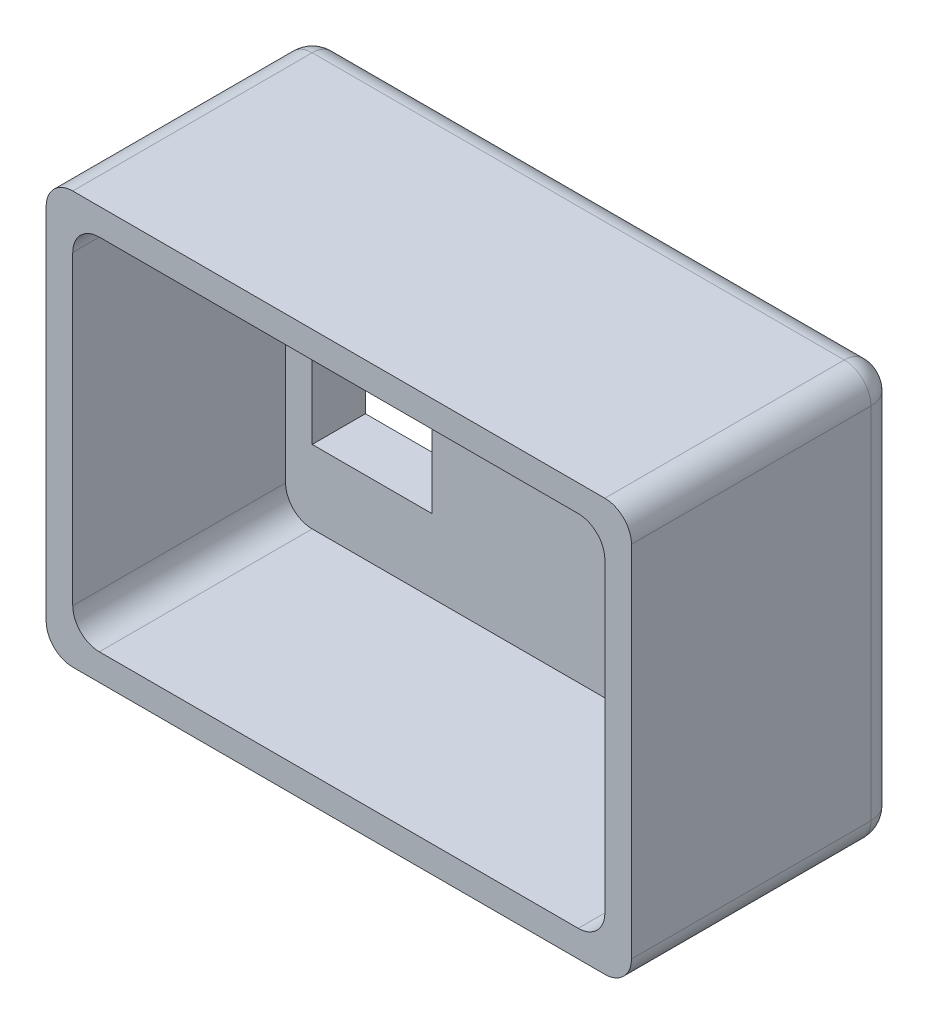
ISO-10303-21;
HEADER;
FILE_DESCRIPTION(('STEP AP214'),'2;1');
FILE_NAME('part.step','',(''),(''),'','','');
FILE_SCHEMA(('AUTOMOTIVE_DESIGN { 1 0 10303 214 1 1 1 1 }'));
ENDSEC;
DATA;
#1=APPLICATION_CONTEXT('core data for automotive mechanical design processes');
#2=APPLICATION_PROTOCOL_DEFINITION('international standard','automotive_design',2000,#1);
#3=PRODUCT_CONTEXT('',#1,'mechanical');
#4=PRODUCT('Part','Part','',(#3));
#5=PRODUCT_RELATED_PRODUCT_CATEGORY('part','',(#4));
#6=PRODUCT_DEFINITION_FORMATION('','',#4);
#7=PRODUCT_DEFINITION_CONTEXT('part definition',#1,'design');
#8=PRODUCT_DEFINITION('design','',#6,#7);
#9=PRODUCT_DEFINITION_SHAPE('','',#8);
#10=(LENGTH_UNIT() NAMED_UNIT(*) SI_UNIT(.MILLI.,.METRE.));
#11=(NAMED_UNIT(*) PLANE_ANGLE_UNIT() SI_UNIT($,.RADIAN.));
#12=(NAMED_UNIT(*) SI_UNIT($,.STERADIAN.) SOLID_ANGLE_UNIT());
#13=UNCERTAINTY_MEASURE_WITH_UNIT(LENGTH_MEASURE(1.E-05),#10,'distance_accuracy_value','');
#14=(GEOMETRIC_REPRESENTATION_CONTEXT(3) GLOBAL_UNCERTAINTY_ASSIGNED_CONTEXT((#13)) GLOBAL_UNIT_ASSIGNED_CONTEXT((#10,
#11,#12)) REPRESENTATION_CONTEXT('',''));
#15=CARTESIAN_POINT('',(0.,0.,0.));
#16=DIRECTION('',(0.,0.,1.));
#17=DIRECTION('',(1.,0.,0.));
#18=AXIS2_PLACEMENT_3D('',#15,#16,#17);
#19=CARTESIAN_POINT('',(0.,0.,2.));
#20=DIRECTION('',(0.,0.,-1.));
#21=DIRECTION('',(-1.,0.,0.));
#22=AXIS2_PLACEMENT_3D('',#19,#20,#21);
#23=PLANE('',#22);
#24=DIRECTION('',(1.,0.,0.));
#25=VECTOR('',#24,1.);
#26=CARTESIAN_POINT('',(1.,2.75,2.));
#27=LINE('',#26,#25);
#28=CARTESIAN_POINT('',(1.,2.75,2.));
#29=VERTEX_POINT('',#28);
#30=CARTESIAN_POINT('',(5.5,2.75,2.));
#31=VERTEX_POINT('',#30);
#32=EDGE_CURVE('E225',#29,#31,#27,.T.);
#33=ORIENTED_EDGE('',*,*,#32,.F.);
#34=DIRECTION('',(0.,-1.,0.));
#35=VECTOR('',#34,1.);
#36=CARTESIAN_POINT('',(1.,11.75,2.));
#37=LINE('',#36,#35);
#38=CARTESIAN_POINT('',(1.,11.75,2.));
#39=VERTEX_POINT('',#38);
#40=EDGE_CURVE('E230',#39,#29,#37,.T.);
#41=ORIENTED_EDGE('',*,*,#40,.F.);
#42=DIRECTION('',(-1.,0.,0.));
#43=VECTOR('',#42,1.);
#44=CARTESIAN_POINT('',(1.,11.75,2.));
#45=LINE('',#44,#43);
#46=CARTESIAN_POINT('',(5.5,11.75,2.));
#47=VERTEX_POINT('',#46);
#48=EDGE_CURVE('E234',#47,#39,#45,.T.);
#49=ORIENTED_EDGE('',*,*,#48,.F.);
#50=DIRECTION('',(0.,1.,0.));
#51=VECTOR('',#50,1.);
#52=CARTESIAN_POINT('',(5.5,11.75,2.));
#53=LINE('',#52,#51);
#54=EDGE_CURVE('E214',#31,#47,#53,.T.);
#55=ORIENTED_EDGE('',*,*,#54,.F.);
#56=EDGE_LOOP('',(#33,#41,#49,#55));
#57=FACE_BOUND('',#56,.T.);
#58=DIRECTION('',(0.,-1.,0.));
#59=VECTOR('',#58,1.);
#60=CARTESIAN_POINT('',(0.,0.,2.));
#61=LINE('',#60,#59);
#62=CARTESIAN_POINT('',(0.,12.5,2.));
#63=VERTEX_POINT('',#62);
#64=CARTESIAN_POINT('',(0.,1.,2.));
#65=VERTEX_POINT('',#64);
#66=EDGE_CURVE('E267',#63,#65,#61,.T.);
#67=ORIENTED_EDGE('',*,*,#66,.T.);
#68=CARTESIAN_POINT('',(1.,1.,2.));
#69=DIRECTION('',(0.,0.,-1.));
#70=DIRECTION('',(-1.,0.,0.));
#71=AXIS2_PLACEMENT_3D('',#68,#69,#70);
#72=CIRCLE('',#71,1.);
#73=CARTESIAN_POINT('',(1.,0.,2.));
#74=VERTEX_POINT('',#73);
#75=EDGE_CURVE('E297',#65,#74,#72,.F.);
#76=ORIENTED_EDGE('',*,*,#75,.T.);
#77=DIRECTION('',(1.,0.,0.));
#78=VECTOR('',#77,1.);
#79=CARTESIAN_POINT('',(0.,0.,2.));
#80=LINE('',#79,#78);
#81=CARTESIAN_POINT('',(19.,0.,2.));
#82=VERTEX_POINT('',#81);
#83=EDGE_CURVE('E270',#74,#82,#80,.T.);
#84=ORIENTED_EDGE('',*,*,#83,.T.);
#85=CARTESIAN_POINT('',(19.,1.,2.));
#86=DIRECTION('',(0.,0.,-1.));
#87=DIRECTION('',(-1.,0.,0.));
#88=AXIS2_PLACEMENT_3D('',#85,#86,#87);
#89=CIRCLE('',#88,1.);
#90=CARTESIAN_POINT('',(20.,1.,2.));
#91=VERTEX_POINT('',#90);
#92=EDGE_CURVE('E291',#82,#91,#89,.F.);
#93=ORIENTED_EDGE('',*,*,#92,.T.);
#94=DIRECTION('',(0.,1.,0.));
#95=VECTOR('',#94,1.);
#96=CARTESIAN_POINT('',(20.,0.,2.));
#97=LINE('',#96,#95);
#98=CARTESIAN_POINT('',(20.,12.5,2.));
#99=VERTEX_POINT('',#98);
#100=EDGE_CURVE('E273',#91,#99,#97,.T.);
#101=ORIENTED_EDGE('',*,*,#100,.T.);
#102=CARTESIAN_POINT('',(19.,12.5,2.));
#103=DIRECTION('',(0.,0.,-1.));
#104=DIRECTION('',(-1.,0.,0.));
#105=AXIS2_PLACEMENT_3D('',#102,#103,#104);
#106=CIRCLE('',#105,1.);
#107=CARTESIAN_POINT('',(19.,13.5,2.));
#108=VERTEX_POINT('',#107);
#109=EDGE_CURVE('E293',#99,#108,#106,.F.);
#110=ORIENTED_EDGE('',*,*,#109,.T.);
#111=DIRECTION('',(-1.,0.,0.));
#112=VECTOR('',#111,1.);
#113=CARTESIAN_POINT('',(0.,13.5,2.));
#114=LINE('',#113,#112);
#115=CARTESIAN_POINT('',(1.,13.5,2.));
#116=VERTEX_POINT('',#115);
#117=EDGE_CURVE('E276',#108,#116,#114,.T.);
#118=ORIENTED_EDGE('',*,*,#117,.T.);
#119=CARTESIAN_POINT('',(1.,12.5,2.));
#120=DIRECTION('',(0.,0.,-1.));
#121=DIRECTION('',(-1.,0.,0.));
#122=AXIS2_PLACEMENT_3D('',#119,#120,#121);
#123=CIRCLE('',#122,1.);
#124=EDGE_CURVE('E295',#116,#63,#123,.F.);
#125=ORIENTED_EDGE('',*,*,#124,.T.);
#126=EDGE_LOOP('',(#67,#76,#84,#93,#101,#110,#118,#125));
#127=FACE_BOUND('',#126,.T.);
#128=ADVANCED_FACE('F59',(#57,#127),#23,.F.);
#129=CARTESIAN_POINT('',(0.,0.,10.));
#130=DIRECTION('',(1.,0.,0.));
#131=DIRECTION('',(0.,0.,-1.));
#132=AXIS2_PLACEMENT_3D('',#129,#130,#131);
#133=PLANE('',#132);
#134=DIRECTION('',(0.,-1.,0.));
#135=VECTOR('',#134,1.);
#136=CARTESIAN_POINT('',(0.,0.,10.));
#137=LINE('',#136,#135);
#138=CARTESIAN_POINT('',(0.,12.5,10.));
#139=VERTEX_POINT('',#138);
#140=CARTESIAN_POINT('',(0.,1.,10.));
#141=VERTEX_POINT('',#140);
#142=EDGE_CURVE('E241',#139,#141,#137,.T.);
#143=ORIENTED_EDGE('',*,*,#142,.T.);
#144=DIRECTION('',(0.,0.,-1.));
#145=VECTOR('',#144,1.);
#146=CARTESIAN_POINT('',(0.,1.,2.));
#147=LINE('',#146,#145);
#148=EDGE_CURVE('E288',#141,#65,#147,.T.);
#149=ORIENTED_EDGE('',*,*,#148,.T.);
#150=ORIENTED_EDGE('',*,*,#66,.F.);
#151=DIRECTION('',(0.,0.,-1.));
#152=VECTOR('',#151,1.);
#153=CARTESIAN_POINT('',(0.,12.5,10.));
#154=LINE('',#153,#152);
#155=EDGE_CURVE('E286',#63,#139,#154,.F.);
#156=ORIENTED_EDGE('',*,*,#155,.T.);
#157=EDGE_LOOP('',(#143,#149,#150,#156));
#158=FACE_BOUND('',#157,.T.);
#159=ADVANCED_FACE('F421',(#158),#133,.T.);
#160=CARTESIAN_POINT('',(0.,0.,10.));
#161=DIRECTION('',(0.,1.,0.));
#162=DIRECTION('',(0.,0.,1.));
#163=AXIS2_PLACEMENT_3D('',#160,#161,#162);
#164=PLANE('',#163);
#165=ORIENTED_EDGE('',*,*,#83,.F.);
#166=DIRECTION('',(0.,0.,-1.));
#167=VECTOR('',#166,1.);
#168=CARTESIAN_POINT('',(1.,0.,10.));
#169=LINE('',#168,#167);
#170=CARTESIAN_POINT('',(1.,0.,10.));
#171=VERTEX_POINT('',#170);
#172=EDGE_CURVE('E302',#74,#171,#169,.F.);
#173=ORIENTED_EDGE('',*,*,#172,.T.);
#174=DIRECTION('',(1.,0.,0.));
#175=VECTOR('',#174,1.);
#176=CARTESIAN_POINT('',(0.,0.,10.));
#177=LINE('',#176,#175);
#178=CARTESIAN_POINT('',(19.,0.,10.));
#179=VERTEX_POINT('',#178);
#180=EDGE_CURVE('E246',#171,#179,#177,.T.);
#181=ORIENTED_EDGE('',*,*,#180,.T.);
#182=DIRECTION('',(0.,0.,-1.));
#183=VECTOR('',#182,1.);
#184=CARTESIAN_POINT('',(19.,0.,2.));
#185=LINE('',#184,#183);
#186=EDGE_CURVE('E299',#179,#82,#185,.T.);
#187=ORIENTED_EDGE('',*,*,#186,.T.);
#188=EDGE_LOOP('',(#165,#173,#181,#187));
#189=FACE_BOUND('',#188,.T.);
#190=ADVANCED_FACE('F425',(#189),#164,.T.);
#191=CARTESIAN_POINT('',(20.,0.,10.));
#192=DIRECTION('',(-1.,0.,0.));
#193=DIRECTION('',(0.,0.,1.));
#194=AXIS2_PLACEMENT_3D('',#191,#192,#193);
#195=PLANE('',#194);
#196=DIRECTION('',(0.,1.,0.));
#197=VECTOR('',#196,1.);
#198=CARTESIAN_POINT('',(20.,0.,10.));
#199=LINE('',#198,#197);
#200=CARTESIAN_POINT('',(20.,1.,10.));
#201=VERTEX_POINT('',#200);
#202=CARTESIAN_POINT('',(20.,12.5,10.));
#203=VERTEX_POINT('',#202);
#204=EDGE_CURVE('E249',#201,#203,#199,.T.);
#205=ORIENTED_EDGE('',*,*,#204,.T.);
#206=DIRECTION('',(0.,0.,-1.));
#207=VECTOR('',#206,1.);
#208=CARTESIAN_POINT('',(20.,12.5,2.));
#209=LINE('',#208,#207);
#210=EDGE_CURVE('E311',#203,#99,#209,.T.);
#211=ORIENTED_EDGE('',*,*,#210,.T.);
#212=ORIENTED_EDGE('',*,*,#100,.F.);
#213=DIRECTION('',(0.,0.,-1.));
#214=VECTOR('',#213,1.);
#215=CARTESIAN_POINT('',(20.,1.,10.));
#216=LINE('',#215,#214);
#217=EDGE_CURVE('E309',#91,#201,#216,.F.);
#218=ORIENTED_EDGE('',*,*,#217,.T.);
#219=EDGE_LOOP('',(#205,#211,#212,#218));
#220=FACE_BOUND('',#219,.T.);
#221=ADVANCED_FACE('F446',(#220),#195,.T.);
#222=CARTESIAN_POINT('',(0.,13.5,10.));
#223=DIRECTION('',(0.,-1.,0.));
#224=DIRECTION('',(0.,0.,-1.));
#225=AXIS2_PLACEMENT_3D('',#222,#223,#224);
#226=PLANE('',#225);
#227=DIRECTION('',(-1.,0.,0.));
#228=VECTOR('',#227,1.);
#229=CARTESIAN_POINT('',(0.,13.5,10.));
#230=LINE('',#229,#228);
#231=CARTESIAN_POINT('',(19.,13.5,10.));
#232=VERTEX_POINT('',#231);
#233=CARTESIAN_POINT('',(1.,13.5,10.));
#234=VERTEX_POINT('',#233);
#235=EDGE_CURVE('E252',#232,#234,#230,.T.);
#236=ORIENTED_EDGE('',*,*,#235,.T.);
#237=DIRECTION('',(0.,0.,-1.));
#238=VECTOR('',#237,1.);
#239=CARTESIAN_POINT('',(1.,13.5,2.));
#240=LINE('',#239,#238);
#241=EDGE_CURVE('E306',#234,#116,#240,.T.);
#242=ORIENTED_EDGE('',*,*,#241,.T.);
#243=ORIENTED_EDGE('',*,*,#117,.F.);
#244=DIRECTION('',(0.,0.,-1.));
#245=VECTOR('',#244,1.);
#246=CARTESIAN_POINT('',(19.,13.5,10.));
#247=LINE('',#246,#245);
#248=EDGE_CURVE('E304',#108,#232,#247,.F.);
#249=ORIENTED_EDGE('',*,*,#248,.T.);
#250=EDGE_LOOP('',(#236,#242,#243,#249));
#251=FACE_BOUND('',#250,.T.);
#252=ADVANCED_FACE('F441',(#251),#226,.T.);
#253=CARTESIAN_POINT('',(0.,0.,10.));
#254=DIRECTION('',(0.,0.,1.));
#255=DIRECTION('',(1.,0.,0.));
#256=AXIS2_PLACEMENT_3D('',#253,#254,#255);
#257=PLANE('',#256);
#258=DIRECTION('',(0.,-1.,0.));
#259=VECTOR('',#258,1.);
#260=CARTESIAN_POINT('',(-1.,0.,10.));
#261=LINE('',#260,#259);
#262=CARTESIAN_POINT('',(-1.,13.5,10.));
#263=VERTEX_POINT('',#262);
#264=CARTESIAN_POINT('',(-1.,0.,10.));
#265=VERTEX_POINT('',#264);
#266=EDGE_CURVE('E255',#263,#265,#261,.T.);
#267=ORIENTED_EDGE('',*,*,#266,.T.);
#268=CARTESIAN_POINT('',(0.,0.,10.));
#269=DIRECTION('',(0.,0.,1.));
#270=DIRECTION('',(1.,0.,0.));
#271=AXIS2_PLACEMENT_3D('',#268,#269,#270);
#272=CIRCLE('',#271,1.);
#273=CARTESIAN_POINT('',(0.,-1.,10.));
#274=VERTEX_POINT('',#273);
#275=EDGE_CURVE('E329',#265,#274,#272,.T.);
#276=ORIENTED_EDGE('',*,*,#275,.T.);
#277=DIRECTION('',(1.,0.,0.));
#278=VECTOR('',#277,1.);
#279=CARTESIAN_POINT('',(0.,-1.,10.));
#280=LINE('',#279,#278);
#281=CARTESIAN_POINT('',(20.,-1.,10.));
#282=VERTEX_POINT('',#281);
#283=EDGE_CURVE('E258',#274,#282,#280,.T.);
#284=ORIENTED_EDGE('',*,*,#283,.T.);
#285=CARTESIAN_POINT('',(20.,0.,10.));
#286=DIRECTION('',(0.,0.,1.));
#287=DIRECTION('',(1.,0.,0.));
#288=AXIS2_PLACEMENT_3D('',#285,#286,#287);
#289=CIRCLE('',#288,1.);
#290=CARTESIAN_POINT('',(21.,0.,10.));
#291=VERTEX_POINT('',#290);
#292=EDGE_CURVE('E325',#282,#291,#289,.T.);
#293=ORIENTED_EDGE('',*,*,#292,.T.);
#294=DIRECTION('',(0.,1.,0.));
#295=VECTOR('',#294,1.);
#296=CARTESIAN_POINT('',(21.,0.,10.));
#297=LINE('',#296,#295);
#298=CARTESIAN_POINT('',(21.,13.5,10.));
#299=VERTEX_POINT('',#298);
#300=EDGE_CURVE('E261',#291,#299,#297,.T.);
#301=ORIENTED_EDGE('',*,*,#300,.T.);
#302=CARTESIAN_POINT('',(20.,13.5,10.));
#303=DIRECTION('',(0.,0.,1.));
#304=DIRECTION('',(1.,0.,0.));
#305=AXIS2_PLACEMENT_3D('',#302,#303,#304);
#306=CIRCLE('',#305,1.);
#307=CARTESIAN_POINT('',(20.,14.5,10.));
#308=VERTEX_POINT('',#307);
#309=EDGE_CURVE('E323',#299,#308,#306,.T.);
#310=ORIENTED_EDGE('',*,*,#309,.T.);
#311=DIRECTION('',(-1.,0.,0.));
#312=VECTOR('',#311,1.);
#313=CARTESIAN_POINT('',(0.,14.5,10.));
#314=LINE('',#313,#312);
#315=CARTESIAN_POINT('',(0.,14.5,10.));
#316=VERTEX_POINT('',#315);
#317=EDGE_CURVE('E264',#308,#316,#314,.T.);
#318=ORIENTED_EDGE('',*,*,#317,.T.);
#319=CARTESIAN_POINT('',(0.,13.5,10.));
#320=DIRECTION('',(0.,0.,1.));
#321=DIRECTION('',(1.,0.,0.));
#322=AXIS2_PLACEMENT_3D('',#319,#320,#321);
#323=CIRCLE('',#322,1.);
#324=EDGE_CURVE('E327',#316,#263,#323,.T.);
#325=ORIENTED_EDGE('',*,*,#324,.T.);
#326=EDGE_LOOP('',(#267,#276,#284,#293,#301,#310,#318,#325));
#327=FACE_BOUND('',#326,.T.);
#328=ORIENTED_EDGE('',*,*,#180,.F.);
#329=CARTESIAN_POINT('',(1.,1.,10.));
#330=DIRECTION('',(0.,0.,1.));
#331=DIRECTION('',(1.,0.,0.));
#332=AXIS2_PLACEMENT_3D('',#329,#330,#331);
#333=CIRCLE('',#332,1.);
#334=EDGE_CURVE('E340',#171,#141,#333,.F.);
#335=ORIENTED_EDGE('',*,*,#334,.T.);
#336=ORIENTED_EDGE('',*,*,#142,.F.);
#337=CARTESIAN_POINT('',(1.,12.5,10.));
#338=DIRECTION('',(0.,0.,1.));
#339=DIRECTION('',(1.,0.,0.));
#340=AXIS2_PLACEMENT_3D('',#337,#338,#339);
#341=CIRCLE('',#340,1.);
#342=EDGE_CURVE('E342',#139,#234,#341,.F.);
#343=ORIENTED_EDGE('',*,*,#342,.T.);
#344=ORIENTED_EDGE('',*,*,#235,.F.);
#345=CARTESIAN_POINT('',(19.,12.5,10.));
#346=DIRECTION('',(0.,0.,1.));
#347=DIRECTION('',(1.,0.,0.));
#348=AXIS2_PLACEMENT_3D('',#345,#346,#347);
#349=CIRCLE('',#348,1.);
#350=EDGE_CURVE('E344',#232,#203,#349,.F.);
#351=ORIENTED_EDGE('',*,*,#350,.T.);
#352=ORIENTED_EDGE('',*,*,#204,.F.);
#353=CARTESIAN_POINT('',(19.,1.,10.));
#354=DIRECTION('',(0.,0.,1.));
#355=DIRECTION('',(1.,0.,0.));
#356=AXIS2_PLACEMENT_3D('',#353,#354,#355);
#357=CIRCLE('',#356,1.);
#358=EDGE_CURVE('E346',#201,#179,#357,.F.);
#359=ORIENTED_EDGE('',*,*,#358,.T.);
#360=EDGE_LOOP('',(#328,#335,#336,#343,#344,#351,#352,#359));
#361=FACE_BOUND('',#360,.T.);
#362=ADVANCED_FACE('F433',(#327,#361),#257,.T.);
#363=CARTESIAN_POINT('',(-1.,0.,10.));
#364=DIRECTION('',(1.,0.,0.));
#365=DIRECTION('',(0.,0.,-1.));
#366=AXIS2_PLACEMENT_3D('',#363,#364,#365);
#367=PLANE('',#366);
#368=DIRECTION('',(0.,0.,-1.));
#369=VECTOR('',#368,1.);
#370=CARTESIAN_POINT('',(-1.,13.5,10.));
#371=LINE('',#370,#369);
#372=CARTESIAN_POINT('',(-1.,13.5,0.999999999999999));
#373=VERTEX_POINT('',#372);
#374=EDGE_CURVE('E318',#263,#373,#371,.T.);
#375=ORIENTED_EDGE('',*,*,#374,.T.);
#376=DIRECTION('',(0.,-1.,0.));
#377=VECTOR('',#376,1.);
#378=CARTESIAN_POINT('',(-1.,0.,0.999999999999999));
#379=LINE('',#378,#377);
#380=CARTESIAN_POINT('',(-1.,0.,0.999999999999999));
#381=VERTEX_POINT('',#380);
#382=EDGE_CURVE('E351',#373,#381,#379,.T.);
#383=ORIENTED_EDGE('',*,*,#382,.T.);
#384=DIRECTION('',(0.,0.,-1.));
#385=VECTOR('',#384,1.);
#386=CARTESIAN_POINT('',(-1.,0.,10.));
#387=LINE('',#386,#385);
#388=EDGE_CURVE('E321',#381,#265,#387,.F.);
#389=ORIENTED_EDGE('',*,*,#388,.T.);
#390=ORIENTED_EDGE('',*,*,#266,.F.);
#391=EDGE_LOOP('',(#375,#383,#389,#390));
#392=FACE_BOUND('',#391,.T.);
#393=ADVANCED_FACE('F429',(#392),#367,.F.);
#394=CARTESIAN_POINT('',(0.,-1.,10.));
#395=DIRECTION('',(0.,1.,0.));
#396=DIRECTION('',(0.,0.,1.));
#397=AXIS2_PLACEMENT_3D('',#394,#395,#396);
#398=PLANE('',#397);
#399=DIRECTION('',(0.,0.,-1.));
#400=VECTOR('',#399,1.);
#401=CARTESIAN_POINT('',(0.,-1.,10.));
#402=LINE('',#401,#400);
#403=CARTESIAN_POINT('',(0.,-1.,0.999999999999999));
#404=VERTEX_POINT('',#403);
#405=EDGE_CURVE('E316',#274,#404,#402,.T.);
#406=ORIENTED_EDGE('',*,*,#405,.T.);
#407=DIRECTION('',(1.,0.,0.));
#408=VECTOR('',#407,1.);
#409=CARTESIAN_POINT('',(20.,-1.,0.999999999999999));
#410=LINE('',#409,#408);
#411=CARTESIAN_POINT('',(20.,-1.,0.999999999999999));
#412=VERTEX_POINT('',#411);
#413=EDGE_CURVE('E12',#404,#412,#410,.T.);
#414=ORIENTED_EDGE('',*,*,#413,.T.);
#415=DIRECTION('',(0.,0.,-1.));
#416=VECTOR('',#415,1.);
#417=CARTESIAN_POINT('',(20.,-1.,10.));
#418=LINE('',#417,#416);
#419=EDGE_CURVE('E314',#412,#282,#418,.F.);
#420=ORIENTED_EDGE('',*,*,#419,.T.);
#421=ORIENTED_EDGE('',*,*,#283,.F.);
#422=EDGE_LOOP('',(#406,#414,#420,#421));
#423=FACE_BOUND('',#422,.T.);
#424=ADVANCED_FACE('F432',(#423),#398,.F.);
#425=CARTESIAN_POINT('',(21.,0.,10.));
#426=DIRECTION('',(-1.,0.,0.));
#427=DIRECTION('',(0.,0.,1.));
#428=AXIS2_PLACEMENT_3D('',#425,#426,#427);
#429=PLANE('',#428);
#430=DIRECTION('',(0.,0.,-1.));
#431=VECTOR('',#430,1.);
#432=CARTESIAN_POINT('',(21.,0.,10.));
#433=LINE('',#432,#431);
#434=CARTESIAN_POINT('',(21.,0.,0.999999999999999));
#435=VERTEX_POINT('',#434);
#436=EDGE_CURVE('E338',#291,#435,#433,.T.);
#437=ORIENTED_EDGE('',*,*,#436,.T.);
#438=DIRECTION('',(0.,1.,0.));
#439=VECTOR('',#438,1.);
#440=CARTESIAN_POINT('',(21.,13.5,0.999999999999999));
#441=LINE('',#440,#439);
#442=CARTESIAN_POINT('',(21.,13.5,0.999999999999999));
#443=VERTEX_POINT('',#442);
#444=EDGE_CURVE('E368',#435,#443,#441,.T.);
#445=ORIENTED_EDGE('',*,*,#444,.T.);
#446=DIRECTION('',(0.,0.,-1.));
#447=VECTOR('',#446,1.);
#448=CARTESIAN_POINT('',(21.,13.5,10.));
#449=LINE('',#448,#447);
#450=EDGE_CURVE('E336',#443,#299,#449,.F.);
#451=ORIENTED_EDGE('',*,*,#450,.T.);
#452=ORIENTED_EDGE('',*,*,#300,.F.);
#453=EDGE_LOOP('',(#437,#445,#451,#452));
#454=FACE_BOUND('',#453,.T.);
#455=ADVANCED_FACE('F415',(#454),#429,.F.);
#456=CARTESIAN_POINT('',(0.,14.5,10.));
#457=DIRECTION('',(0.,-1.,0.));
#458=DIRECTION('',(0.,0.,-1.));
#459=AXIS2_PLACEMENT_3D('',#456,#457,#458);
#460=PLANE('',#459);
#461=DIRECTION('',(0.,0.,-1.));
#462=VECTOR('',#461,1.);
#463=CARTESIAN_POINT('',(20.,14.5,10.));
#464=LINE('',#463,#462);
#465=CARTESIAN_POINT('',(20.,14.5,0.999999999999999));
#466=VERTEX_POINT('',#465);
#467=EDGE_CURVE('E331',#308,#466,#464,.T.);
#468=ORIENTED_EDGE('',*,*,#467,.T.);
#469=DIRECTION('',(-1.,0.,0.));
#470=VECTOR('',#469,1.);
#471=CARTESIAN_POINT('',(0.,14.5,0.999999999999999));
#472=LINE('',#471,#470);
#473=CARTESIAN_POINT('',(0.,14.5,0.999999999999999));
#474=VERTEX_POINT('',#473);
#475=EDGE_CURVE('E364',#466,#474,#472,.T.);
#476=ORIENTED_EDGE('',*,*,#475,.T.);
#477=DIRECTION('',(0.,0.,-1.));
#478=VECTOR('',#477,1.);
#479=CARTESIAN_POINT('',(0.,14.5,10.));
#480=LINE('',#479,#478);
#481=EDGE_CURVE('E334',#474,#316,#480,.F.);
#482=ORIENTED_EDGE('',*,*,#481,.T.);
#483=ORIENTED_EDGE('',*,*,#317,.F.);
#484=EDGE_LOOP('',(#468,#476,#482,#483));
#485=FACE_BOUND('',#484,.T.);
#486=ADVANCED_FACE('F407',(#485),#460,.F.);
#487=CARTESIAN_POINT('',(0.,0.,0.));
#488=DIRECTION('',(0.,0.,-1.));
#489=DIRECTION('',(-1.,0.,0.));
#490=AXIS2_PLACEMENT_3D('',#487,#488,#489);
#491=PLANE('',#490);
#492=DIRECTION('',(1.,0.,0.));
#493=VECTOR('',#492,1.);
#494=CARTESIAN_POINT('',(0.,0.,0.));
#495=LINE('',#494,#493);
#496=CARTESIAN_POINT('',(20.,0.,0.));
#497=VERTEX_POINT('',#496);
#498=CARTESIAN_POINT('',(0.,0.,0.));
#499=VERTEX_POINT('',#498);
#500=EDGE_CURVE('E353',#497,#499,#495,.F.);
#501=ORIENTED_EDGE('',*,*,#500,.T.);
#502=DIRECTION('',(0.,-1.,0.));
#503=VECTOR('',#502,1.);
#504=CARTESIAN_POINT('',(0.,13.5,0.));
#505=LINE('',#504,#503);
#506=CARTESIAN_POINT('',(0.,13.5,0.));
#507=VERTEX_POINT('',#506);
#508=EDGE_CURVE('E359',#499,#507,#505,.F.);
#509=ORIENTED_EDGE('',*,*,#508,.T.);
#510=DIRECTION('',(-1.,0.,0.));
#511=VECTOR('',#510,1.);
#512=CARTESIAN_POINT('',(20.,13.5,0.));
#513=LINE('',#512,#511);
#514=CARTESIAN_POINT('',(20.,13.5,0.));
#515=VERTEX_POINT('',#514);
#516=EDGE_CURVE('E357',#507,#515,#513,.F.);
#517=ORIENTED_EDGE('',*,*,#516,.T.);
#518=DIRECTION('',(0.,1.,0.));
#519=VECTOR('',#518,1.);
#520=CARTESIAN_POINT('',(20.,0.,0.));
#521=LINE('',#520,#519);
#522=EDGE_CURVE('E355',#515,#497,#521,.F.);
#523=ORIENTED_EDGE('',*,*,#522,.T.);
#524=EDGE_LOOP('',(#501,#509,#517,#523));
#525=FACE_BOUND('',#524,.T.);
#526=DIRECTION('',(0.,1.,0.));
#527=VECTOR('',#526,1.);
#528=CARTESIAN_POINT('',(1.,0.,0.));
#529=LINE('',#528,#527);
#530=CARTESIAN_POINT('',(1.,2.75,0.));
#531=VERTEX_POINT('',#530);
#532=CARTESIAN_POINT('',(1.,11.75,0.));
#533=VERTEX_POINT('',#532);
#534=EDGE_CURVE('E284',#531,#533,#529,.T.);
#535=ORIENTED_EDGE('',*,*,#534,.F.);
#536=DIRECTION('',(-1.,0.,0.));
#537=VECTOR('',#536,1.);
#538=CARTESIAN_POINT('',(0.,2.75,0.));
#539=LINE('',#538,#537);
#540=CARTESIAN_POINT('',(5.5,2.75,0.));
#541=VERTEX_POINT('',#540);
#542=EDGE_CURVE('E279',#541,#531,#539,.T.);
#543=ORIENTED_EDGE('',*,*,#542,.F.);
#544=DIRECTION('',(0.,-1.,0.));
#545=VECTOR('',#544,1.);
#546=CARTESIAN_POINT('',(5.5,0.,0.));
#547=LINE('',#546,#545);
#548=CARTESIAN_POINT('',(5.5,11.75,0.));
#549=VERTEX_POINT('',#548);
#550=EDGE_CURVE('E217',#549,#541,#547,.T.);
#551=ORIENTED_EDGE('',*,*,#550,.F.);
#552=DIRECTION('',(1.,0.,0.));
#553=VECTOR('',#552,1.);
#554=CARTESIAN_POINT('',(0.,11.75,0.));
#555=LINE('',#554,#553);
#556=EDGE_CURVE('E282',#533,#549,#555,.T.);
#557=ORIENTED_EDGE('',*,*,#556,.F.);
#558=EDGE_LOOP('',(#535,#543,#551,#557));
#559=FACE_BOUND('',#558,.T.);
#560=ADVANCED_FACE('F405',(#525,#559),#491,.T.);
#561=CARTESIAN_POINT('',(1.,11.75,-8.));
#562=DIRECTION('',(-1.,0.,0.));
#563=DIRECTION('',(0.,-1.,0.));
#564=AXIS2_PLACEMENT_3D('',#561,#562,#563);
#565=PLANE('',#564);
#566=ORIENTED_EDGE('',*,*,#534,.T.);
#567=DIRECTION('',(0.,0.,1.));
#568=VECTOR('',#567,1.);
#569=CARTESIAN_POINT('',(1.,11.75,-8.));
#570=LINE('',#569,#568);
#571=EDGE_CURVE('E239',#533,#39,#570,.T.);
#572=ORIENTED_EDGE('',*,*,#571,.T.);
#573=ORIENTED_EDGE('',*,*,#40,.T.);
#574=DIRECTION('',(0.,0.,1.));
#575=VECTOR('',#574,1.);
#576=CARTESIAN_POINT('',(1.,2.75,-8.));
#577=LINE('',#576,#575);
#578=EDGE_CURVE('E221',#531,#29,#577,.T.);
#579=ORIENTED_EDGE('',*,*,#578,.F.);
#580=EDGE_LOOP('',(#566,#572,#573,#579));
#581=FACE_BOUND('',#580,.T.);
#582=ADVANCED_FACE('F398',(#581),#565,.F.);
#583=CARTESIAN_POINT('',(1.,11.75,-8.));
#584=DIRECTION('',(0.,1.,0.));
#585=DIRECTION('',(0.,0.,1.));
#586=AXIS2_PLACEMENT_3D('',#583,#584,#585);
#587=PLANE('',#586);
#588=ORIENTED_EDGE('',*,*,#556,.T.);
#589=DIRECTION('',(0.,0.,1.));
#590=VECTOR('',#589,1.);
#591=CARTESIAN_POINT('',(5.5,11.75,-8.));
#592=LINE('',#591,#590);
#593=EDGE_CURVE('E220',#549,#47,#592,.T.);
#594=ORIENTED_EDGE('',*,*,#593,.T.);
#595=ORIENTED_EDGE('',*,*,#48,.T.);
#596=ORIENTED_EDGE('',*,*,#571,.F.);
#597=EDGE_LOOP('',(#588,#594,#595,#596));
#598=FACE_BOUND('',#597,.T.);
#599=ADVANCED_FACE('F403',(#598),#587,.F.);
#600=CARTESIAN_POINT('',(5.5,11.75,-8.));
#601=DIRECTION('',(1.,0.,0.));
#602=DIRECTION('',(0.,1.,0.));
#603=AXIS2_PLACEMENT_3D('',#600,#601,#602);
#604=PLANE('',#603);
#605=ORIENTED_EDGE('',*,*,#550,.T.);
#606=DIRECTION('',(0.,0.,1.));
#607=VECTOR('',#606,1.);
#608=CARTESIAN_POINT('',(5.5,2.75,-8.));
#609=LINE('',#608,#607);
#610=EDGE_CURVE('E209',#541,#31,#609,.T.);
#611=ORIENTED_EDGE('',*,*,#610,.T.);
#612=ORIENTED_EDGE('',*,*,#54,.T.);
#613=ORIENTED_EDGE('',*,*,#593,.F.);
#614=EDGE_LOOP('',(#605,#611,#612,#613));
#615=FACE_BOUND('',#614,.T.);
#616=ADVANCED_FACE('F211',(#615),#604,.F.);
#617=CARTESIAN_POINT('',(1.,2.75,-8.));
#618=DIRECTION('',(0.,-1.,0.));
#619=DIRECTION('',(1.,0.,0.));
#620=AXIS2_PLACEMENT_3D('',#617,#618,#619);
#621=PLANE('',#620);
#622=ORIENTED_EDGE('',*,*,#542,.T.);
#623=ORIENTED_EDGE('',*,*,#578,.T.);
#624=ORIENTED_EDGE('',*,*,#32,.T.);
#625=ORIENTED_EDGE('',*,*,#610,.F.);
#626=EDGE_LOOP('',(#622,#623,#624,#625));
#627=FACE_BOUND('',#626,.T.);
#628=ADVANCED_FACE('F226',(#627),#621,.F.);
#629=CARTESIAN_POINT('',(1.,1.,10.));
#630=DIRECTION('',(0.,0.,1.));
#631=DIRECTION('',(1.,0.,0.));
#632=AXIS2_PLACEMENT_3D('',#629,#630,#631);
#633=CYLINDRICAL_SURFACE('',#632,1.);
#634=ORIENTED_EDGE('',*,*,#334,.F.);
#635=ORIENTED_EDGE('',*,*,#172,.F.);
#636=ORIENTED_EDGE('',*,*,#75,.F.);
#637=ORIENTED_EDGE('',*,*,#148,.F.);
#638=EDGE_LOOP('',(#634,#635,#636,#637));
#639=FACE_BOUND('',#638,.T.);
#640=ADVANCED_FACE('F456',(#639),#633,.F.);
#641=CARTESIAN_POINT('',(1.,12.5,10.));
#642=DIRECTION('',(0.,0.,1.));
#643=DIRECTION('',(1.,0.,0.));
#644=AXIS2_PLACEMENT_3D('',#641,#642,#643);
#645=CYLINDRICAL_SURFACE('',#644,1.);
#646=ORIENTED_EDGE('',*,*,#342,.F.);
#647=ORIENTED_EDGE('',*,*,#155,.F.);
#648=ORIENTED_EDGE('',*,*,#124,.F.);
#649=ORIENTED_EDGE('',*,*,#241,.F.);
#650=EDGE_LOOP('',(#646,#647,#648,#649));
#651=FACE_BOUND('',#650,.T.);
#652=ADVANCED_FACE('F478',(#651),#645,.F.);
#653=CARTESIAN_POINT('',(19.,12.5,10.));
#654=DIRECTION('',(0.,0.,1.));
#655=DIRECTION('',(1.,0.,0.));
#656=AXIS2_PLACEMENT_3D('',#653,#654,#655);
#657=CYLINDRICAL_SURFACE('',#656,1.);
#658=ORIENTED_EDGE('',*,*,#350,.F.);
#659=ORIENTED_EDGE('',*,*,#248,.F.);
#660=ORIENTED_EDGE('',*,*,#109,.F.);
#661=ORIENTED_EDGE('',*,*,#210,.F.);
#662=EDGE_LOOP('',(#658,#659,#660,#661));
#663=FACE_BOUND('',#662,.T.);
#664=ADVANCED_FACE('F486',(#663),#657,.F.);
#665=CARTESIAN_POINT('',(19.,1.,10.));
#666=DIRECTION('',(0.,0.,1.));
#667=DIRECTION('',(1.,0.,0.));
#668=AXIS2_PLACEMENT_3D('',#665,#666,#667);
#669=CYLINDRICAL_SURFACE('',#668,1.);
#670=ORIENTED_EDGE('',*,*,#358,.F.);
#671=ORIENTED_EDGE('',*,*,#217,.F.);
#672=ORIENTED_EDGE('',*,*,#92,.F.);
#673=ORIENTED_EDGE('',*,*,#186,.F.);
#674=EDGE_LOOP('',(#670,#671,#672,#673));
#675=FACE_BOUND('',#674,.T.);
#676=ADVANCED_FACE('F494',(#675),#669,.F.);
#677=CARTESIAN_POINT('',(0.,0.,10.));
#678=DIRECTION('',(0.,0.,-1.));
#679=DIRECTION('',(-1.,0.,0.));
#680=AXIS2_PLACEMENT_3D('',#677,#678,#679);
#681=CYLINDRICAL_SURFACE('',#680,1.);
#682=ORIENTED_EDGE('',*,*,#388,.F.);
#683=CARTESIAN_POINT('',(0.,0.,0.999999999999999));
#684=DIRECTION('',(0.,0.,-1.));
#685=DIRECTION('',(-1.,0.,0.));
#686=AXIS2_PLACEMENT_3D('',#683,#684,#685);
#687=CIRCLE('',#686,1.);
#688=EDGE_CURVE('E348',#381,#404,#687,.F.);
#689=ORIENTED_EDGE('',*,*,#688,.T.);
#690=ORIENTED_EDGE('',*,*,#405,.F.);
#691=ORIENTED_EDGE('',*,*,#275,.F.);
#692=EDGE_LOOP('',(#682,#689,#690,#691));
#693=FACE_BOUND('',#692,.T.);
#694=ADVANCED_FACE('F502',(#693),#681,.T.);
#695=CARTESIAN_POINT('',(0.,13.5,10.));
#696=DIRECTION('',(0.,0.,-1.));
#697=DIRECTION('',(-1.,0.,0.));
#698=AXIS2_PLACEMENT_3D('',#695,#696,#697);
#699=CYLINDRICAL_SURFACE('',#698,1.);
#700=ORIENTED_EDGE('',*,*,#481,.F.);
#701=CARTESIAN_POINT('',(0.,13.5,0.999999999999999));
#702=DIRECTION('',(0.,0.,-1.));
#703=DIRECTION('',(-1.,0.,0.));
#704=AXIS2_PLACEMENT_3D('',#701,#702,#703);
#705=CIRCLE('',#704,1.);
#706=EDGE_CURVE('E362',#474,#373,#705,.F.);
#707=ORIENTED_EDGE('',*,*,#706,.T.);
#708=ORIENTED_EDGE('',*,*,#374,.F.);
#709=ORIENTED_EDGE('',*,*,#324,.F.);
#710=EDGE_LOOP('',(#700,#707,#708,#709));
#711=FACE_BOUND('',#710,.T.);
#712=ADVANCED_FACE('F511',(#711),#699,.T.);
#713=CARTESIAN_POINT('',(20.,0.,10.));
#714=DIRECTION('',(0.,0.,-1.));
#715=DIRECTION('',(-1.,0.,0.));
#716=AXIS2_PLACEMENT_3D('',#713,#714,#715);
#717=CYLINDRICAL_SURFACE('',#716,1.);
#718=ORIENTED_EDGE('',*,*,#419,.F.);
#719=CARTESIAN_POINT('',(20.,0.,0.999999999999999));
#720=DIRECTION('',(0.,0.,-1.));
#721=DIRECTION('',(-1.,0.,0.));
#722=AXIS2_PLACEMENT_3D('',#719,#720,#721);
#723=CIRCLE('',#722,1.);
#724=EDGE_CURVE('E68',#412,#435,#723,.F.);
#725=ORIENTED_EDGE('',*,*,#724,.T.);
#726=ORIENTED_EDGE('',*,*,#436,.F.);
#727=ORIENTED_EDGE('',*,*,#292,.F.);
#728=EDGE_LOOP('',(#718,#725,#726,#727));
#729=FACE_BOUND('',#728,.T.);
#730=ADVANCED_FACE('F519',(#729),#717,.T.);
#731=CARTESIAN_POINT('',(20.,13.5,10.));
#732=DIRECTION('',(0.,0.,-1.));
#733=DIRECTION('',(-1.,0.,0.));
#734=AXIS2_PLACEMENT_3D('',#731,#732,#733);
#735=CYLINDRICAL_SURFACE('',#734,1.);
#736=ORIENTED_EDGE('',*,*,#450,.F.);
#737=CARTESIAN_POINT('',(20.,13.5,0.999999999999999));
#738=DIRECTION('',(0.,0.,-1.));
#739=DIRECTION('',(-1.,0.,0.));
#740=AXIS2_PLACEMENT_3D('',#737,#738,#739);
#741=CIRCLE('',#740,1.);
#742=EDGE_CURVE('E366',#443,#466,#741,.F.);
#743=ORIENTED_EDGE('',*,*,#742,.T.);
#744=ORIENTED_EDGE('',*,*,#467,.F.);
#745=ORIENTED_EDGE('',*,*,#309,.F.);
#746=EDGE_LOOP('',(#736,#743,#744,#745));
#747=FACE_BOUND('',#746,.T.);
#748=ADVANCED_FACE('F527',(#747),#735,.T.);
#749=CARTESIAN_POINT('',(20.,13.5,0.999999999999999));
#750=DIRECTION('',(0.,0.,-1.));
#751=DIRECTION('',(-1.,0.,0.));
#752=AXIS2_PLACEMENT_3D('',#749,#750,#751);
#753=SPHERICAL_SURFACE('',#752,1.);
#754=CARTESIAN_POINT('',(20.,13.5,0.999999999999999));
#755=DIRECTION('',(-1.,0.,0.));
#756=DIRECTION('',(0.,0.,1.));
#757=AXIS2_PLACEMENT_3D('',#754,#755,#756);
#758=CIRCLE('',#757,1.);
#759=EDGE_CURVE('E386',#466,#515,#758,.T.);
#760=ORIENTED_EDGE('',*,*,#759,.F.);
#761=ORIENTED_EDGE('',*,*,#742,.F.);
#762=CARTESIAN_POINT('',(20.,13.5,1.));
#763=DIRECTION('',(0.,-1.,0.));
#764=DIRECTION('',(0.,0.,-1.));
#765=AXIS2_PLACEMENT_3D('',#762,#763,#764);
#766=CIRCLE('',#765,1.);
#767=EDGE_CURVE('E63',#515,#443,#766,.T.);
#768=ORIENTED_EDGE('',*,*,#767,.F.);
#769=EDGE_LOOP('',(#760,#761,#768));
#770=FACE_BOUND('',#769,.T.);
#771=ADVANCED_FACE('F61',(#770),#753,.T.);
#772=CARTESIAN_POINT('',(20.,0.,0.999999999999999));
#773=DIRECTION('',(0.,-1.,0.));
#774=DIRECTION('',(0.,0.,-1.));
#775=AXIS2_PLACEMENT_3D('',#772,#773,#774);
#776=CYLINDRICAL_SURFACE('',#775,1.);
#777=ORIENTED_EDGE('',*,*,#767,.T.);
#778=ORIENTED_EDGE('',*,*,#444,.F.);
#779=CARTESIAN_POINT('',(20.,0.,1.));
#780=DIRECTION('',(0.,-1.,0.));
#781=DIRECTION('',(0.,0.,-1.));
#782=AXIS2_PLACEMENT_3D('',#779,#780,#781);
#783=CIRCLE('',#782,1.);
#784=EDGE_CURVE('E384',#497,#435,#783,.T.);
#785=ORIENTED_EDGE('',*,*,#784,.F.);
#786=ORIENTED_EDGE('',*,*,#522,.F.);
#787=EDGE_LOOP('',(#777,#778,#785,#786));
#788=FACE_BOUND('',#787,.T.);
#789=ADVANCED_FACE('F541',(#788),#776,.T.);
#790=CARTESIAN_POINT('',(0.,13.5,0.999999999999999));
#791=DIRECTION('',(1.,0.,0.));
#792=DIRECTION('',(0.,0.,-1.));
#793=AXIS2_PLACEMENT_3D('',#790,#791,#792);
#794=CYLINDRICAL_SURFACE('',#793,1.);
#795=ORIENTED_EDGE('',*,*,#759,.T.);
#796=ORIENTED_EDGE('',*,*,#516,.F.);
#797=CARTESIAN_POINT('',(0.,13.5,0.999999999999999));
#798=DIRECTION('',(-1.,0.,0.));
#799=DIRECTION('',(0.,0.,1.));
#800=AXIS2_PLACEMENT_3D('',#797,#798,#799);
#801=CIRCLE('',#800,1.);
#802=EDGE_CURVE('E381',#474,#507,#801,.T.);
#803=ORIENTED_EDGE('',*,*,#802,.F.);
#804=ORIENTED_EDGE('',*,*,#475,.F.);
#805=EDGE_LOOP('',(#795,#796,#803,#804));
#806=FACE_BOUND('',#805,.T.);
#807=ADVANCED_FACE('F548',(#806),#794,.T.);
#808=CARTESIAN_POINT('',(20.,0.,0.999999999999999));
#809=DIRECTION('',(0.,0.,-1.));
#810=DIRECTION('',(-1.,0.,0.));
#811=AXIS2_PLACEMENT_3D('',#808,#809,#810);
#812=SPHERICAL_SURFACE('',#811,1.);
#813=ORIENTED_EDGE('',*,*,#784,.T.);
#814=ORIENTED_EDGE('',*,*,#724,.F.);
#815=CARTESIAN_POINT('',(20.,0.,1.));
#816=DIRECTION('',(-1.,0.,0.));
#817=DIRECTION('',(0.,0.,1.));
#818=AXIS2_PLACEMENT_3D('',#815,#816,#817);
#819=CIRCLE('',#818,1.);
#820=EDGE_CURVE('E378',#497,#412,#819,.T.);
#821=ORIENTED_EDGE('',*,*,#820,.F.);
#822=EDGE_LOOP('',(#813,#814,#821));
#823=FACE_BOUND('',#822,.T.);
#824=ADVANCED_FACE('F554',(#823),#812,.T.);
#825=CARTESIAN_POINT('',(0.,13.5,0.999999999999999));
#826=DIRECTION('',(0.,0.,-1.));
#827=DIRECTION('',(-1.,0.,0.));
#828=AXIS2_PLACEMENT_3D('',#825,#826,#827);
#829=SPHERICAL_SURFACE('',#828,1.);
#830=ORIENTED_EDGE('',*,*,#706,.F.);
#831=ORIENTED_EDGE('',*,*,#802,.T.);
#832=CARTESIAN_POINT('',(0.,13.5,0.999999999999999));
#833=DIRECTION('',(0.,-1.,0.));
#834=DIRECTION('',(0.,0.,-1.));
#835=AXIS2_PLACEMENT_3D('',#832,#833,#834);
#836=CIRCLE('',#835,1.);
#837=EDGE_CURVE('E376',#373,#507,#836,.T.);
#838=ORIENTED_EDGE('',*,*,#837,.F.);
#839=EDGE_LOOP('',(#830,#831,#838));
#840=FACE_BOUND('',#839,.T.);
#841=ADVANCED_FACE('F561',(#840),#829,.T.);
#842=CARTESIAN_POINT('',(0.,0.,0.999999999999999));
#843=DIRECTION('',(-1.,0.,0.));
#844=DIRECTION('',(0.,0.,1.));
#845=AXIS2_PLACEMENT_3D('',#842,#843,#844);
#846=CYLINDRICAL_SURFACE('',#845,1.);
#847=ORIENTED_EDGE('',*,*,#820,.T.);
#848=ORIENTED_EDGE('',*,*,#413,.F.);
#849=CARTESIAN_POINT('',(0.,0.,1.));
#850=DIRECTION('',(-1.,0.,0.));
#851=DIRECTION('',(0.,0.,1.));
#852=AXIS2_PLACEMENT_3D('',#849,#850,#851);
#853=CIRCLE('',#852,1.);
#854=EDGE_CURVE('E374',#499,#404,#853,.T.);
#855=ORIENTED_EDGE('',*,*,#854,.F.);
#856=ORIENTED_EDGE('',*,*,#500,.F.);
#857=EDGE_LOOP('',(#847,#848,#855,#856));
#858=FACE_BOUND('',#857,.T.);
#859=ADVANCED_FACE('F569',(#858),#846,.T.);
#860=CARTESIAN_POINT('',(0.,0.,0.999999999999999));
#861=DIRECTION('',(0.,1.,0.));
#862=DIRECTION('',(0.,0.,1.));
#863=AXIS2_PLACEMENT_3D('',#860,#861,#862);
#864=CYLINDRICAL_SURFACE('',#863,1.);
#865=ORIENTED_EDGE('',*,*,#837,.T.);
#866=ORIENTED_EDGE('',*,*,#508,.F.);
#867=CARTESIAN_POINT('',(0.,0.,0.999999999999999));
#868=DIRECTION('',(0.,-1.,0.));
#869=DIRECTION('',(0.,0.,-1.));
#870=AXIS2_PLACEMENT_3D('',#867,#868,#869);
#871=CIRCLE('',#870,1.);
#872=EDGE_CURVE('E371',#381,#499,#871,.T.);
#873=ORIENTED_EDGE('',*,*,#872,.F.);
#874=ORIENTED_EDGE('',*,*,#382,.F.);
#875=EDGE_LOOP('',(#865,#866,#873,#874));
#876=FACE_BOUND('',#875,.T.);
#877=ADVANCED_FACE('F577',(#876),#864,.T.);
#878=CARTESIAN_POINT('',(0.,0.,0.999999999999999));
#879=DIRECTION('',(0.,0.,-1.));
#880=DIRECTION('',(-1.,0.,0.));
#881=AXIS2_PLACEMENT_3D('',#878,#879,#880);
#882=SPHERICAL_SURFACE('',#881,1.);
#883=ORIENTED_EDGE('',*,*,#854,.T.);
#884=ORIENTED_EDGE('',*,*,#688,.F.);
#885=ORIENTED_EDGE('',*,*,#872,.T.);
#886=EDGE_LOOP('',(#883,#884,#885));
#887=FACE_BOUND('',#886,.T.);
#888=ADVANCED_FACE('F585',(#887),#882,.T.);
#889=CLOSED_SHELL('',(#128,#159,#190,#221,#252,#362,#393,#424,#455,#486,#560,#582,#599,#616,
#628,#640,#652,#664,#676,#694,#712,#730,#748,#771,#789,#807,#824,#841,#859,#877,#888));
#890=MANIFOLD_SOLID_BREP('B2',#889);
#891=ADVANCED_BREP_SHAPE_REPRESENTATION('',(#18,#890),#14);
#892=SHAPE_DEFINITION_REPRESENTATION(#9,#891);
ENDSEC;
END-ISO-10303-21;
